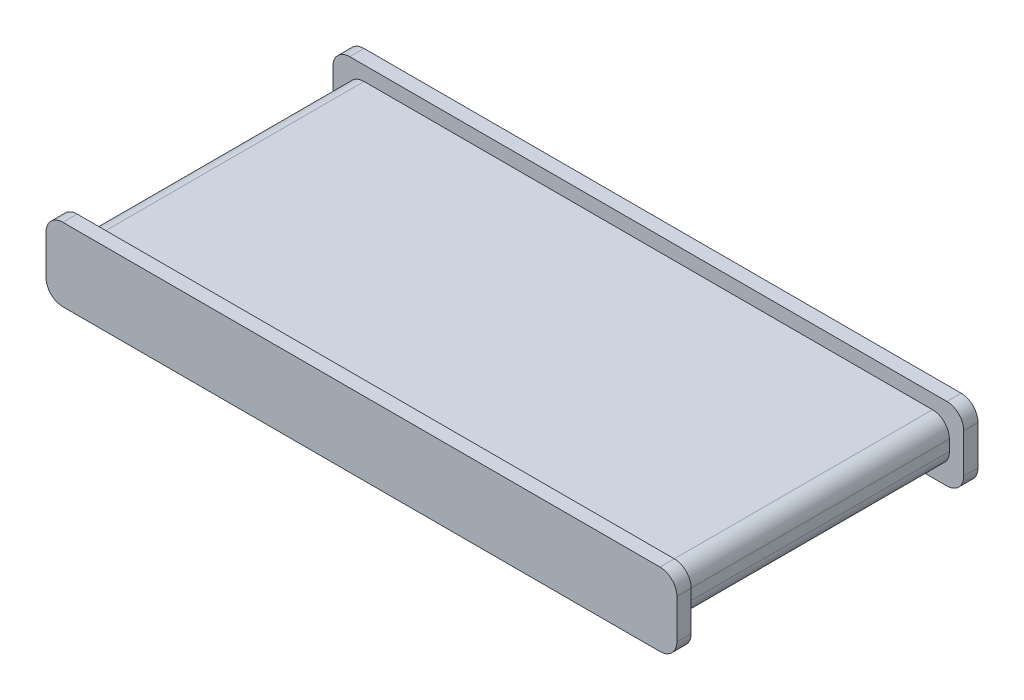
ISO-10303-21;
HEADER;
FILE_DESCRIPTION(('STEP AP214'),'2;1');
FILE_NAME('part.step','',(''),(''),'','','');
FILE_SCHEMA(('AUTOMOTIVE_DESIGN { 1 0 10303 214 1 1 1 1 }'));
ENDSEC;
DATA;
#1=APPLICATION_CONTEXT('core data for automotive mechanical design processes');
#2=APPLICATION_PROTOCOL_DEFINITION('international standard','automotive_design',2000,#1);
#3=PRODUCT_CONTEXT('',#1,'mechanical');
#4=PRODUCT('Part','Part','',(#3));
#5=PRODUCT_RELATED_PRODUCT_CATEGORY('part','',(#4));
#6=PRODUCT_DEFINITION_FORMATION('','',#4);
#7=PRODUCT_DEFINITION_CONTEXT('part definition',#1,'design');
#8=PRODUCT_DEFINITION('design','',#6,#7);
#9=PRODUCT_DEFINITION_SHAPE('','',#8);
#10=(LENGTH_UNIT() NAMED_UNIT(*) SI_UNIT(.MILLI.,.METRE.));
#11=(NAMED_UNIT(*) PLANE_ANGLE_UNIT() SI_UNIT($,.RADIAN.));
#12=(NAMED_UNIT(*) SI_UNIT($,.STERADIAN.) SOLID_ANGLE_UNIT());
#13=UNCERTAINTY_MEASURE_WITH_UNIT(LENGTH_MEASURE(1.E-05),#10,'distance_accuracy_value','');
#14=(GEOMETRIC_REPRESENTATION_CONTEXT(3) GLOBAL_UNCERTAINTY_ASSIGNED_CONTEXT((#13)) GLOBAL_UNIT_ASSIGNED_CONTEXT((#10,
#11,#12)) REPRESENTATION_CONTEXT('',''));
#15=CARTESIAN_POINT('',(0.,0.,0.));
#16=DIRECTION('',(0.,0.,1.));
#17=DIRECTION('',(1.,0.,0.));
#18=AXIS2_PLACEMENT_3D('',#15,#16,#17);
#19=CARTESIAN_POINT('',(107.,0.,48.42));
#20=DIRECTION('',(0.,1.,0.));
#21=DIRECTION('',(-1.,0.,0.));
#22=AXIS2_PLACEMENT_3D('',#19,#20,#21);
#23=PLANE('',#22);
#24=DIRECTION('',(1.,0.,0.));
#25=VECTOR('',#24,1.);
#26=CARTESIAN_POINT('',(107.,0.,0.));
#27=LINE('',#26,#25);
#28=CARTESIAN_POINT('',(3.,0.,0.));
#29=VERTEX_POINT('',#28);
#30=CARTESIAN_POINT('',(104.,0.,0.));
#31=VERTEX_POINT('',#30);
#32=EDGE_CURVE('E377',#29,#31,#27,.T.);
#33=ORIENTED_EDGE('',*,*,#32,.T.);
#34=DIRECTION('',(0.,0.,-1.));
#35=VECTOR('',#34,1.);
#36=CARTESIAN_POINT('',(104.,0.,48.42));
#37=LINE('',#36,#35);
#38=CARTESIAN_POINT('',(104.,0.,48.42));
#39=VERTEX_POINT('',#38);
#40=EDGE_CURVE('E262',#31,#39,#37,.F.);
#41=ORIENTED_EDGE('',*,*,#40,.T.);
#42=DIRECTION('',(1.,0.,0.));
#43=VECTOR('',#42,1.);
#44=CARTESIAN_POINT('',(107.,0.,48.42));
#45=LINE('',#44,#43);
#46=CARTESIAN_POINT('',(3.,0.,48.42));
#47=VERTEX_POINT('',#46);
#48=EDGE_CURVE('E367',#47,#39,#45,.T.);
#49=ORIENTED_EDGE('',*,*,#48,.F.);
#50=DIRECTION('',(0.,0.,-1.));
#51=VECTOR('',#50,1.);
#52=CARTESIAN_POINT('',(3.,0.,48.42));
#53=LINE('',#52,#51);
#54=EDGE_CURVE('E259',#47,#29,#53,.T.);
#55=ORIENTED_EDGE('',*,*,#54,.T.);
#56=EDGE_LOOP('',(#33,#41,#49,#55));
#57=FACE_BOUND('',#56,.T.);
#58=ADVANCED_FACE('F45',(#57),#23,.F.);
#59=CARTESIAN_POINT('',(107.,7.92406687544473,48.42));
#60=DIRECTION('',(-1.,0.,0.));
#61=DIRECTION('',(0.,0.,1.));
#62=AXIS2_PLACEMENT_3D('',#59,#60,#61);
#63=PLANE('',#62);
#64=DIRECTION('',(0.,1.,0.));
#65=VECTOR('',#64,1.);
#66=CARTESIAN_POINT('',(107.,7.92406687544473,0.));
#67=LINE('',#66,#65);
#68=CARTESIAN_POINT('',(107.,3.00000000000001,0.));
#69=VERTEX_POINT('',#68);
#70=CARTESIAN_POINT('',(107.,4.92406687544473,0.));
#71=VERTEX_POINT('',#70);
#72=EDGE_CURVE('E229',#69,#71,#67,.T.);
#73=ORIENTED_EDGE('',*,*,#72,.T.);
#74=DIRECTION('',(0.,0.,-1.));
#75=VECTOR('',#74,1.);
#76=CARTESIAN_POINT('',(107.,4.92406687544473,48.42));
#77=LINE('',#76,#75);
#78=CARTESIAN_POINT('',(107.,4.92406687544473,48.42));
#79=VERTEX_POINT('',#78);
#80=EDGE_CURVE('E247',#71,#79,#77,.F.);
#81=ORIENTED_EDGE('',*,*,#80,.T.);
#82=DIRECTION('',(0.,1.,0.));
#83=VECTOR('',#82,1.);
#84=CARTESIAN_POINT('',(107.,7.92406687544473,48.42));
#85=LINE('',#84,#83);
#86=CARTESIAN_POINT('',(107.,3.00000000000001,48.42));
#87=VERTEX_POINT('',#86);
#88=EDGE_CURVE('E370',#87,#79,#85,.T.);
#89=ORIENTED_EDGE('',*,*,#88,.F.);
#90=DIRECTION('',(0.,0.,-1.));
#91=VECTOR('',#90,1.);
#92=CARTESIAN_POINT('',(107.,3.00000000000001,48.42));
#93=LINE('',#92,#91);
#94=EDGE_CURVE('E244',#87,#69,#93,.T.);
#95=ORIENTED_EDGE('',*,*,#94,.T.);
#96=EDGE_LOOP('',(#73,#81,#89,#95));
#97=FACE_BOUND('',#96,.T.);
#98=ADVANCED_FACE('F402',(#97),#63,.F.);
#99=CARTESIAN_POINT('',(107.,7.92406687544473,48.42));
#100=DIRECTION('',(0.,-1.,0.));
#101=DIRECTION('',(1.,0.,0.));
#102=AXIS2_PLACEMENT_3D('',#99,#100,#101);
#103=PLANE('',#102);
#104=DIRECTION('',(-1.,0.,0.));
#105=VECTOR('',#104,1.);
#106=CARTESIAN_POINT('',(107.,7.92406687544473,48.42));
#107=LINE('',#106,#105);
#108=CARTESIAN_POINT('',(104.,7.92406687544473,48.42));
#109=VERTEX_POINT('',#108);
#110=CARTESIAN_POINT('',(3.,7.92406687544471,48.42));
#111=VERTEX_POINT('',#110);
#112=EDGE_CURVE('E373',#109,#111,#107,.T.);
#113=ORIENTED_EDGE('',*,*,#112,.F.);
#114=DIRECTION('',(0.,0.,-1.));
#115=VECTOR('',#114,1.);
#116=CARTESIAN_POINT('',(104.,7.92406687544473,48.42));
#117=LINE('',#116,#115);
#118=CARTESIAN_POINT('',(104.,7.92406687544473,0.));
#119=VERTEX_POINT('',#118);
#120=EDGE_CURVE('E218',#109,#119,#117,.T.);
#121=ORIENTED_EDGE('',*,*,#120,.T.);
#122=DIRECTION('',(-1.,0.,0.));
#123=VECTOR('',#122,1.);
#124=CARTESIAN_POINT('',(107.,7.92406687544473,0.));
#125=LINE('',#124,#123);
#126=CARTESIAN_POINT('',(3.,7.92406687544471,0.));
#127=VERTEX_POINT('',#126);
#128=EDGE_CURVE('E223',#119,#127,#125,.T.);
#129=ORIENTED_EDGE('',*,*,#128,.T.);
#130=DIRECTION('',(0.,0.,-1.));
#131=VECTOR('',#130,1.);
#132=CARTESIAN_POINT('',(3.,7.92406687544471,48.42));
#133=LINE('',#132,#131);
#134=EDGE_CURVE('E207',#127,#111,#133,.F.);
#135=ORIENTED_EDGE('',*,*,#134,.T.);
#136=EDGE_LOOP('',(#113,#121,#129,#135));
#137=FACE_BOUND('',#136,.T.);
#138=ADVANCED_FACE('F224',(#137),#103,.F.);
#139=CARTESIAN_POINT('',(0.,7.92406687544471,48.42));
#140=DIRECTION('',(1.,0.,0.));
#141=DIRECTION('',(0.,0.,-1.));
#142=AXIS2_PLACEMENT_3D('',#139,#140,#141);
#143=PLANE('',#142);
#144=DIRECTION('',(0.,-1.,0.));
#145=VECTOR('',#144,1.);
#146=CARTESIAN_POINT('',(0.,7.92406687544471,48.42));
#147=LINE('',#146,#145);
#148=CARTESIAN_POINT('',(0.,4.92406687544471,48.42));
#149=VERTEX_POINT('',#148);
#150=CARTESIAN_POINT('',(0.,3.,48.42));
#151=VERTEX_POINT('',#150);
#152=EDGE_CURVE('E219',#149,#151,#147,.T.);
#153=ORIENTED_EDGE('',*,*,#152,.F.);
#154=DIRECTION('',(0.,0.,-1.));
#155=VECTOR('',#154,1.);
#156=CARTESIAN_POINT('',(0.,4.92406687544471,48.42));
#157=LINE('',#156,#155);
#158=CARTESIAN_POINT('',(0.,4.92406687544471,0.));
#159=VERTEX_POINT('',#158);
#160=EDGE_CURVE('E266',#149,#159,#157,.T.);
#161=ORIENTED_EDGE('',*,*,#160,.T.);
#162=DIRECTION('',(0.,-1.,0.));
#163=VECTOR('',#162,1.);
#164=CARTESIAN_POINT('',(0.,7.92406687544471,0.));
#165=LINE('',#164,#163);
#166=CARTESIAN_POINT('',(0.,3.,0.));
#167=VERTEX_POINT('',#166);
#168=EDGE_CURVE('E228',#159,#167,#165,.T.);
#169=ORIENTED_EDGE('',*,*,#168,.T.);
#170=DIRECTION('',(0.,0.,-1.));
#171=VECTOR('',#170,1.);
#172=CARTESIAN_POINT('',(0.,3.,48.42));
#173=LINE('',#172,#171);
#174=EDGE_CURVE('E264',#167,#151,#173,.F.);
#175=ORIENTED_EDGE('',*,*,#174,.T.);
#176=EDGE_LOOP('',(#153,#161,#169,#175));
#177=FACE_BOUND('',#176,.T.);
#178=ADVANCED_FACE('F383',(#177),#143,.F.);
#179=CARTESIAN_POINT('',(104.,4.92406687544473,48.42));
#180=DIRECTION('',(0.,0.,-1.));
#181=DIRECTION('',(-1.,0.,0.));
#182=AXIS2_PLACEMENT_3D('',#179,#180,#181);
#183=CYLINDRICAL_SURFACE('',#182,3.);
#184=CARTESIAN_POINT('',(104.,4.92406687544473,48.42));
#185=DIRECTION('',(0.,0.,1.));
#186=DIRECTION('',(1.,0.,0.));
#187=AXIS2_PLACEMENT_3D('',#184,#185,#186);
#188=CIRCLE('',#187,3.);
#189=EDGE_CURVE('E256',#79,#109,#188,.T.);
#190=ORIENTED_EDGE('',*,*,#189,.F.);
#191=ORIENTED_EDGE('',*,*,#80,.F.);
#192=CARTESIAN_POINT('',(104.,4.92406687544473,0.));
#193=DIRECTION('',(0.,0.,1.));
#194=DIRECTION('',(1.,0.,0.));
#195=AXIS2_PLACEMENT_3D('',#192,#193,#194);
#196=CIRCLE('',#195,3.);
#197=EDGE_CURVE('E238',#119,#71,#196,.F.);
#198=ORIENTED_EDGE('',*,*,#197,.F.);
#199=ORIENTED_EDGE('',*,*,#120,.F.);
#200=EDGE_LOOP('',(#190,#191,#198,#199));
#201=FACE_BOUND('',#200,.T.);
#202=ADVANCED_FACE('F399',(#201),#183,.T.);
#203=CARTESIAN_POINT('',(104.,3.00000000000001,48.42));
#204=DIRECTION('',(0.,0.,-1.));
#205=DIRECTION('',(-1.,0.,0.));
#206=AXIS2_PLACEMENT_3D('',#203,#204,#205);
#207=CYLINDRICAL_SURFACE('',#206,3.);
#208=CARTESIAN_POINT('',(104.,3.00000000000001,48.42));
#209=DIRECTION('',(0.,0.,1.));
#210=DIRECTION('',(1.,0.,0.));
#211=AXIS2_PLACEMENT_3D('',#208,#209,#210);
#212=CIRCLE('',#211,3.);
#213=EDGE_CURVE('E253',#39,#87,#212,.T.);
#214=ORIENTED_EDGE('',*,*,#213,.F.);
#215=ORIENTED_EDGE('',*,*,#40,.F.);
#216=CARTESIAN_POINT('',(104.,3.00000000000001,0.));
#217=DIRECTION('',(0.,0.,1.));
#218=DIRECTION('',(1.,0.,0.));
#219=AXIS2_PLACEMENT_3D('',#216,#217,#218);
#220=CIRCLE('',#219,3.);
#221=EDGE_CURVE('E234',#69,#31,#220,.F.);
#222=ORIENTED_EDGE('',*,*,#221,.F.);
#223=ORIENTED_EDGE('',*,*,#94,.F.);
#224=EDGE_LOOP('',(#214,#215,#222,#223));
#225=FACE_BOUND('',#224,.T.);
#226=ADVANCED_FACE('F394',(#225),#207,.T.);
#227=CARTESIAN_POINT('',(3.,4.92406687544471,48.42));
#228=DIRECTION('',(0.,0.,-1.));
#229=DIRECTION('',(-1.,0.,0.));
#230=AXIS2_PLACEMENT_3D('',#227,#228,#229);
#231=CYLINDRICAL_SURFACE('',#230,3.);
#232=CARTESIAN_POINT('',(3.,4.92406687544471,48.42));
#233=DIRECTION('',(0.,0.,1.));
#234=DIRECTION('',(1.,0.,0.));
#235=AXIS2_PLACEMENT_3D('',#232,#233,#234);
#236=CIRCLE('',#235,3.);
#237=EDGE_CURVE('E215',#111,#149,#236,.T.);
#238=ORIENTED_EDGE('',*,*,#237,.F.);
#239=ORIENTED_EDGE('',*,*,#134,.F.);
#240=CARTESIAN_POINT('',(3.,4.92406687544471,0.));
#241=DIRECTION('',(0.,0.,1.));
#242=DIRECTION('',(1.,0.,0.));
#243=AXIS2_PLACEMENT_3D('',#240,#241,#242);
#244=CIRCLE('',#243,3.);
#245=EDGE_CURVE('E212',#159,#127,#244,.F.);
#246=ORIENTED_EDGE('',*,*,#245,.F.);
#247=ORIENTED_EDGE('',*,*,#160,.F.);
#248=EDGE_LOOP('',(#238,#239,#246,#247));
#249=FACE_BOUND('',#248,.T.);
#250=ADVANCED_FACE('F209',(#249),#231,.T.);
#251=CARTESIAN_POINT('',(3.,3.,48.42));
#252=DIRECTION('',(0.,0.,-1.));
#253=DIRECTION('',(-1.,0.,0.));
#254=AXIS2_PLACEMENT_3D('',#251,#252,#253);
#255=CYLINDRICAL_SURFACE('',#254,3.);
#256=CARTESIAN_POINT('',(3.,3.,48.42));
#257=DIRECTION('',(0.,0.,1.));
#258=DIRECTION('',(1.,0.,0.));
#259=AXIS2_PLACEMENT_3D('',#256,#257,#258);
#260=CIRCLE('',#259,3.);
#261=EDGE_CURVE('E249',#151,#47,#260,.T.);
#262=ORIENTED_EDGE('',*,*,#261,.F.);
#263=ORIENTED_EDGE('',*,*,#174,.F.);
#264=CARTESIAN_POINT('',(3.,3.,0.));
#265=DIRECTION('',(0.,0.,1.));
#266=DIRECTION('',(1.,0.,0.));
#267=AXIS2_PLACEMENT_3D('',#264,#265,#266);
#268=CIRCLE('',#267,3.);
#269=EDGE_CURVE('E235',#29,#167,#268,.F.);
#270=ORIENTED_EDGE('',*,*,#269,.F.);
#271=ORIENTED_EDGE('',*,*,#54,.F.);
#272=EDGE_LOOP('',(#262,#263,#270,#271));
#273=FACE_BOUND('',#272,.T.);
#274=ADVANCED_FACE('F386',(#273),#255,.T.);
#275=CARTESIAN_POINT('',(-2.54,-2.54,50.96));
#276=DIRECTION('',(1.,0.,0.));
#277=DIRECTION('',(0.,0.,-1.));
#278=AXIS2_PLACEMENT_3D('',#275,#276,#277);
#279=PLANE('',#278);
#280=DIRECTION('',(0.,-1.,0.));
#281=VECTOR('',#280,1.);
#282=CARTESIAN_POINT('',(-2.54,-2.54,50.96));
#283=LINE('',#282,#281);
#284=CARTESIAN_POINT('',(-2.54,7.46406687544473,50.96));
#285=VERTEX_POINT('',#284);
#286=CARTESIAN_POINT('',(-2.54,0.46,50.96));
#287=VERTEX_POINT('',#286);
#288=EDGE_CURVE('E337',#285,#287,#283,.T.);
#289=ORIENTED_EDGE('',*,*,#288,.F.);
#290=DIRECTION('',(0.,0.,-1.));
#291=VECTOR('',#290,1.);
#292=CARTESIAN_POINT('',(-2.54,7.46406687544473,50.96));
#293=LINE('',#292,#291);
#294=CARTESIAN_POINT('',(-2.54,7.46406687544473,48.42));
#295=VERTEX_POINT('',#294);
#296=EDGE_CURVE('E11',#285,#295,#293,.T.);
#297=ORIENTED_EDGE('',*,*,#296,.T.);
#298=DIRECTION('',(0.,-1.,0.));
#299=VECTOR('',#298,1.);
#300=CARTESIAN_POINT('',(-2.54,-2.54,48.42));
#301=LINE('',#300,#299);
#302=CARTESIAN_POINT('',(-2.54,0.46,48.42));
#303=VERTEX_POINT('',#302);
#304=EDGE_CURVE('E340',#295,#303,#301,.T.);
#305=ORIENTED_EDGE('',*,*,#304,.T.);
#306=DIRECTION('',(0.,0.,-1.));
#307=VECTOR('',#306,1.);
#308=CARTESIAN_POINT('',(-2.54,0.46,50.96));
#309=LINE('',#308,#307);
#310=EDGE_CURVE('E53',#303,#287,#309,.F.);
#311=ORIENTED_EDGE('',*,*,#310,.T.);
#312=EDGE_LOOP('',(#289,#297,#305,#311));
#313=FACE_BOUND('',#312,.T.);
#314=ADVANCED_FACE('F336',(#313),#279,.F.);
#315=CARTESIAN_POINT('',(-2.54,-2.54,50.96));
#316=DIRECTION('',(0.,1.,0.));
#317=DIRECTION('',(0.,0.,1.));
#318=AXIS2_PLACEMENT_3D('',#315,#316,#317);
#319=PLANE('',#318);
#320=DIRECTION('',(1.,0.,0.));
#321=VECTOR('',#320,1.);
#322=CARTESIAN_POINT('',(-2.54,-2.54,48.42));
#323=LINE('',#322,#321);
#324=CARTESIAN_POINT('',(0.459999999999999,-2.54,48.42));
#325=VERTEX_POINT('',#324);
#326=CARTESIAN_POINT('',(106.54,-2.54,48.42));
#327=VERTEX_POINT('',#326);
#328=EDGE_CURVE('E352',#325,#327,#323,.T.);
#329=ORIENTED_EDGE('',*,*,#328,.T.);
#330=DIRECTION('',(0.,0.,-1.));
#331=VECTOR('',#330,1.);
#332=CARTESIAN_POINT('',(106.54,-2.54,50.96));
#333=LINE('',#332,#331);
#334=CARTESIAN_POINT('',(106.54,-2.54,50.96));
#335=VERTEX_POINT('',#334);
#336=EDGE_CURVE('E60',#327,#335,#333,.F.);
#337=ORIENTED_EDGE('',*,*,#336,.T.);
#338=DIRECTION('',(1.,0.,0.));
#339=VECTOR('',#338,1.);
#340=CARTESIAN_POINT('',(-2.54,-2.54,50.96));
#341=LINE('',#340,#339);
#342=CARTESIAN_POINT('',(0.459999999999999,-2.54,50.96));
#343=VERTEX_POINT('',#342);
#344=EDGE_CURVE('E346',#343,#335,#341,.T.);
#345=ORIENTED_EDGE('',*,*,#344,.F.);
#346=DIRECTION('',(0.,0.,-1.));
#347=VECTOR('',#346,1.);
#348=CARTESIAN_POINT('',(0.46,-2.54,50.96));
#349=LINE('',#348,#347);
#350=EDGE_CURVE('E329',#343,#325,#349,.T.);
#351=ORIENTED_EDGE('',*,*,#350,.T.);
#352=EDGE_LOOP('',(#329,#337,#345,#351));
#353=FACE_BOUND('',#352,.T.);
#354=ADVANCED_FACE('F351',(#353),#319,.F.);
#355=CARTESIAN_POINT('',(109.54,-2.54,50.96));
#356=DIRECTION('',(-1.,0.,0.));
#357=DIRECTION('',(0.,0.,1.));
#358=AXIS2_PLACEMENT_3D('',#355,#356,#357);
#359=PLANE('',#358);
#360=DIRECTION('',(0.,1.,0.));
#361=VECTOR('',#360,1.);
#362=CARTESIAN_POINT('',(109.54,-2.54,48.42));
#363=LINE('',#362,#361);
#364=CARTESIAN_POINT('',(109.54,0.46,48.42));
#365=VERTEX_POINT('',#364);
#366=CARTESIAN_POINT('',(109.54,7.46406687544473,48.42));
#367=VERTEX_POINT('',#366);
#368=EDGE_CURVE('E357',#365,#367,#363,.T.);
#369=ORIENTED_EDGE('',*,*,#368,.T.);
#370=DIRECTION('',(0.,0.,-1.));
#371=VECTOR('',#370,1.);
#372=CARTESIAN_POINT('',(109.54,7.46406687544473,50.96));
#373=LINE('',#372,#371);
#374=CARTESIAN_POINT('',(109.54,7.46406687544473,50.96));
#375=VERTEX_POINT('',#374);
#376=EDGE_CURVE('E320',#367,#375,#373,.F.);
#377=ORIENTED_EDGE('',*,*,#376,.T.);
#378=DIRECTION('',(0.,1.,0.));
#379=VECTOR('',#378,1.);
#380=CARTESIAN_POINT('',(109.54,-2.54,50.96));
#381=LINE('',#380,#379);
#382=CARTESIAN_POINT('',(109.54,0.46,50.96));
#383=VERTEX_POINT('',#382);
#384=EDGE_CURVE('E462',#383,#375,#381,.T.);
#385=ORIENTED_EDGE('',*,*,#384,.F.);
#386=DIRECTION('',(0.,0.,-1.));
#387=VECTOR('',#386,1.);
#388=CARTESIAN_POINT('',(109.54,0.46,50.96));
#389=LINE('',#388,#387);
#390=EDGE_CURVE('E317',#383,#365,#389,.T.);
#391=ORIENTED_EDGE('',*,*,#390,.T.);
#392=EDGE_LOOP('',(#369,#377,#385,#391));
#393=FACE_BOUND('',#392,.T.);
#394=ADVANCED_FACE('F459',(#393),#359,.F.);
#395=CARTESIAN_POINT('',(-2.54,10.4640668754447,50.96));
#396=DIRECTION('',(0.,-1.,0.));
#397=DIRECTION('',(0.,0.,-1.));
#398=AXIS2_PLACEMENT_3D('',#395,#396,#397);
#399=PLANE('',#398);
#400=DIRECTION('',(-1.,0.,0.));
#401=VECTOR('',#400,1.);
#402=CARTESIAN_POINT('',(-2.54,10.4640668754447,50.96));
#403=LINE('',#402,#401);
#404=CARTESIAN_POINT('',(106.54,10.4640668754447,50.96));
#405=VERTEX_POINT('',#404);
#406=CARTESIAN_POINT('',(0.459999999999999,10.4640668754447,50.96));
#407=VERTEX_POINT('',#406);
#408=EDGE_CURVE('E379',#405,#407,#403,.T.);
#409=ORIENTED_EDGE('',*,*,#408,.F.);
#410=DIRECTION('',(0.,0.,-1.));
#411=VECTOR('',#410,1.);
#412=CARTESIAN_POINT('',(106.54,10.4640668754447,50.96));
#413=LINE('',#412,#411);
#414=CARTESIAN_POINT('',(106.54,10.4640668754447,48.42));
#415=VERTEX_POINT('',#414);
#416=EDGE_CURVE('E306',#405,#415,#413,.T.);
#417=ORIENTED_EDGE('',*,*,#416,.T.);
#418=DIRECTION('',(-1.,0.,0.));
#419=VECTOR('',#418,1.);
#420=CARTESIAN_POINT('',(-2.54,10.4640668754447,48.42));
#421=LINE('',#420,#419);
#422=CARTESIAN_POINT('',(0.459999999999999,10.4640668754447,48.42));
#423=VERTEX_POINT('',#422);
#424=EDGE_CURVE('E347',#415,#423,#421,.T.);
#425=ORIENTED_EDGE('',*,*,#424,.T.);
#426=DIRECTION('',(0.,0.,-1.));
#427=VECTOR('',#426,1.);
#428=CARTESIAN_POINT('',(0.46,10.4640668754447,50.96));
#429=LINE('',#428,#427);
#430=EDGE_CURVE('E304',#423,#407,#429,.F.);
#431=ORIENTED_EDGE('',*,*,#430,.T.);
#432=EDGE_LOOP('',(#409,#417,#425,#431));
#433=FACE_BOUND('',#432,.T.);
#434=ADVANCED_FACE('F454',(#433),#399,.F.);
#435=CARTESIAN_POINT('',(0.,0.,50.96));
#436=DIRECTION('',(0.,0.,-1.));
#437=DIRECTION('',(-1.,0.,0.));
#438=AXIS2_PLACEMENT_3D('',#435,#436,#437);
#439=PLANE('',#438);
#440=ORIENTED_EDGE('',*,*,#384,.T.);
#441=CARTESIAN_POINT('',(106.54,7.46406687544473,50.96));
#442=DIRECTION('',(0.,0.,-1.));
#443=DIRECTION('',(-1.,0.,0.));
#444=AXIS2_PLACEMENT_3D('',#441,#442,#443);
#445=CIRCLE('',#444,3.);
#446=EDGE_CURVE('E327',#375,#405,#445,.F.);
#447=ORIENTED_EDGE('',*,*,#446,.T.);
#448=ORIENTED_EDGE('',*,*,#408,.T.);
#449=CARTESIAN_POINT('',(0.46,7.46406687544473,50.96));
#450=DIRECTION('',(0.,0.,-1.));
#451=DIRECTION('',(-1.,0.,0.));
#452=AXIS2_PLACEMENT_3D('',#449,#450,#451);
#453=CIRCLE('',#452,3.);
#454=EDGE_CURVE('E323',#407,#285,#453,.F.);
#455=ORIENTED_EDGE('',*,*,#454,.T.);
#456=ORIENTED_EDGE('',*,*,#288,.T.);
#457=CARTESIAN_POINT('',(0.46,0.46,50.96));
#458=DIRECTION('',(0.,0.,-1.));
#459=DIRECTION('',(-1.,0.,0.));
#460=AXIS2_PLACEMENT_3D('',#457,#458,#459);
#461=CIRCLE('',#460,3.);
#462=EDGE_CURVE('E67',#287,#343,#461,.F.);
#463=ORIENTED_EDGE('',*,*,#462,.T.);
#464=ORIENTED_EDGE('',*,*,#344,.T.);
#465=CARTESIAN_POINT('',(106.54,0.46,50.96));
#466=DIRECTION('',(0.,0.,-1.));
#467=DIRECTION('',(-1.,0.,0.));
#468=AXIS2_PLACEMENT_3D('',#465,#466,#467);
#469=CIRCLE('',#468,3.);
#470=EDGE_CURVE('E325',#335,#383,#469,.F.);
#471=ORIENTED_EDGE('',*,*,#470,.T.);
#472=EDGE_LOOP('',(#440,#447,#448,#455,#456,#463,#464,#471));
#473=FACE_BOUND('',#472,.T.);
#474=ADVANCED_FACE('F343',(#473),#439,.F.);
#475=CARTESIAN_POINT('',(0.,0.,48.42));
#476=DIRECTION('',(0.,0.,-1.));
#477=DIRECTION('',(-1.,0.,0.));
#478=AXIS2_PLACEMENT_3D('',#475,#476,#477);
#479=PLANE('',#478);
#480=ORIENTED_EDGE('',*,*,#213,.T.);
#481=ORIENTED_EDGE('',*,*,#88,.T.);
#482=ORIENTED_EDGE('',*,*,#189,.T.);
#483=ORIENTED_EDGE('',*,*,#112,.T.);
#484=ORIENTED_EDGE('',*,*,#237,.T.);
#485=ORIENTED_EDGE('',*,*,#152,.T.);
#486=ORIENTED_EDGE('',*,*,#261,.T.);
#487=ORIENTED_EDGE('',*,*,#48,.T.);
#488=EDGE_LOOP('',(#480,#481,#482,#483,#484,#485,#486,#487));
#489=FACE_BOUND('',#488,.T.);
#490=ORIENTED_EDGE('',*,*,#424,.F.);
#491=CARTESIAN_POINT('',(106.54,7.46406687544473,48.42));
#492=DIRECTION('',(0.,0.,-1.));
#493=DIRECTION('',(-1.,0.,0.));
#494=AXIS2_PLACEMENT_3D('',#491,#492,#493);
#495=CIRCLE('',#494,3.);
#496=EDGE_CURVE('E315',#415,#367,#495,.T.);
#497=ORIENTED_EDGE('',*,*,#496,.T.);
#498=ORIENTED_EDGE('',*,*,#368,.F.);
#499=CARTESIAN_POINT('',(106.54,0.46,48.42));
#500=DIRECTION('',(0.,0.,-1.));
#501=DIRECTION('',(-1.,0.,0.));
#502=AXIS2_PLACEMENT_3D('',#499,#500,#501);
#503=CIRCLE('',#502,3.);
#504=EDGE_CURVE('E313',#365,#327,#503,.T.);
#505=ORIENTED_EDGE('',*,*,#504,.T.);
#506=ORIENTED_EDGE('',*,*,#328,.F.);
#507=CARTESIAN_POINT('',(0.46,0.46,48.42));
#508=DIRECTION('',(0.,0.,-1.));
#509=DIRECTION('',(-1.,0.,0.));
#510=AXIS2_PLACEMENT_3D('',#507,#508,#509);
#511=CIRCLE('',#510,3.);
#512=EDGE_CURVE('E309',#325,#303,#511,.T.);
#513=ORIENTED_EDGE('',*,*,#512,.T.);
#514=ORIENTED_EDGE('',*,*,#304,.F.);
#515=CARTESIAN_POINT('',(0.46,7.46406687544473,48.42));
#516=DIRECTION('',(0.,0.,-1.));
#517=DIRECTION('',(-1.,0.,0.));
#518=AXIS2_PLACEMENT_3D('',#515,#516,#517);
#519=CIRCLE('',#518,3.);
#520=EDGE_CURVE('E311',#295,#423,#519,.T.);
#521=ORIENTED_EDGE('',*,*,#520,.T.);
#522=EDGE_LOOP('',(#490,#497,#498,#505,#506,#513,#514,#521));
#523=FACE_BOUND('',#522,.T.);
#524=ADVANCED_FACE('F355',(#489,#523),#479,.T.);
#525=CARTESIAN_POINT('',(0.,0.,0.));
#526=DIRECTION('',(0.,0.,-1.));
#527=DIRECTION('',(-1.,0.,0.));
#528=AXIS2_PLACEMENT_3D('',#525,#526,#527);
#529=PLANE('',#528);
#530=DIRECTION('',(0.,1.,0.));
#531=VECTOR('',#530,1.);
#532=CARTESIAN_POINT('',(-2.54,10.4640668754447,0.));
#533=LINE('',#532,#531);
#534=CARTESIAN_POINT('',(-2.54,0.46,0.));
#535=VERTEX_POINT('',#534);
#536=CARTESIAN_POINT('',(-2.54,7.46406687544473,0.));
#537=VERTEX_POINT('',#536);
#538=EDGE_CURVE('E471',#535,#537,#533,.T.);
#539=ORIENTED_EDGE('',*,*,#538,.F.);
#540=CARTESIAN_POINT('',(0.46,0.46,0.));
#541=DIRECTION('',(0.,0.,-1.));
#542=DIRECTION('',(-1.,0.,0.));
#543=AXIS2_PLACEMENT_3D('',#540,#541,#542);
#544=CIRCLE('',#543,3.);
#545=CARTESIAN_POINT('',(0.46000000000003,-2.54,0.));
#546=VERTEX_POINT('',#545);
#547=EDGE_CURVE('E279',#535,#546,#544,.F.);
#548=ORIENTED_EDGE('',*,*,#547,.T.);
#549=DIRECTION('',(-1.,0.,0.));
#550=VECTOR('',#549,1.);
#551=CARTESIAN_POINT('',(109.54,-2.54,0.));
#552=LINE('',#551,#550);
#553=CARTESIAN_POINT('',(106.54,-2.54,0.));
#554=VERTEX_POINT('',#553);
#555=EDGE_CURVE('E474',#554,#546,#552,.T.);
#556=ORIENTED_EDGE('',*,*,#555,.F.);
#557=CARTESIAN_POINT('',(106.54,0.46,0.));
#558=DIRECTION('',(0.,0.,-1.));
#559=DIRECTION('',(-1.,0.,0.));
#560=AXIS2_PLACEMENT_3D('',#557,#558,#559);
#561=CIRCLE('',#560,3.);
#562=CARTESIAN_POINT('',(109.54,0.46,0.));
#563=VERTEX_POINT('',#562);
#564=EDGE_CURVE('E273',#554,#563,#561,.F.);
#565=ORIENTED_EDGE('',*,*,#564,.T.);
#566=DIRECTION('',(0.,-1.,0.));
#567=VECTOR('',#566,1.);
#568=CARTESIAN_POINT('',(109.54,10.4640668754447,0.));
#569=LINE('',#568,#567);
#570=CARTESIAN_POINT('',(109.54,7.46406687544473,0.));
#571=VERTEX_POINT('',#570);
#572=EDGE_CURVE('E477',#571,#563,#569,.T.);
#573=ORIENTED_EDGE('',*,*,#572,.F.);
#574=CARTESIAN_POINT('',(106.54,7.46406687544473,0.));
#575=DIRECTION('',(0.,0.,-1.));
#576=DIRECTION('',(-1.,0.,0.));
#577=AXIS2_PLACEMENT_3D('',#574,#575,#576);
#578=CIRCLE('',#577,3.);
#579=CARTESIAN_POINT('',(106.54,10.4640668754447,0.));
#580=VERTEX_POINT('',#579);
#581=EDGE_CURVE('E275',#571,#580,#578,.F.);
#582=ORIENTED_EDGE('',*,*,#581,.T.);
#583=DIRECTION('',(1.,0.,0.));
#584=VECTOR('',#583,1.);
#585=CARTESIAN_POINT('',(109.54,10.4640668754447,0.));
#586=LINE('',#585,#584);
#587=CARTESIAN_POINT('',(0.46000000000003,10.4640668754447,0.));
#588=VERTEX_POINT('',#587);
#589=EDGE_CURVE('E467',#588,#580,#586,.T.);
#590=ORIENTED_EDGE('',*,*,#589,.F.);
#591=CARTESIAN_POINT('',(0.460000000000002,7.46406687544473,0.));
#592=DIRECTION('',(0.,0.,-1.));
#593=DIRECTION('',(-1.,0.,0.));
#594=AXIS2_PLACEMENT_3D('',#591,#592,#593);
#595=CIRCLE('',#594,3.);
#596=EDGE_CURVE('E277',#588,#537,#595,.F.);
#597=ORIENTED_EDGE('',*,*,#596,.T.);
#598=EDGE_LOOP('',(#539,#548,#556,#565,#573,#582,#590,#597));
#599=FACE_BOUND('',#598,.T.);
#600=ORIENTED_EDGE('',*,*,#128,.F.);
#601=ORIENTED_EDGE('',*,*,#197,.T.);
#602=ORIENTED_EDGE('',*,*,#72,.F.);
#603=ORIENTED_EDGE('',*,*,#221,.T.);
#604=ORIENTED_EDGE('',*,*,#32,.F.);
#605=ORIENTED_EDGE('',*,*,#269,.T.);
#606=ORIENTED_EDGE('',*,*,#168,.F.);
#607=ORIENTED_EDGE('',*,*,#245,.T.);
#608=EDGE_LOOP('',(#600,#601,#602,#603,#604,#605,#606,#607));
#609=FACE_BOUND('',#608,.T.);
#610=ADVANCED_FACE('F232',(#599,#609),#529,.F.);
#611=CARTESIAN_POINT('',(109.54,10.4640668754447,-2.54));
#612=DIRECTION('',(-1.,0.,0.));
#613=DIRECTION('',(0.,0.,1.));
#614=AXIS2_PLACEMENT_3D('',#611,#612,#613);
#615=PLANE('',#614);
#616=DIRECTION('',(0.,-1.,0.));
#617=VECTOR('',#616,1.);
#618=CARTESIAN_POINT('',(109.54,10.4640668754447,-2.54));
#619=LINE('',#618,#617);
#620=CARTESIAN_POINT('',(109.54,7.46406687544473,-2.54));
#621=VERTEX_POINT('',#620);
#622=CARTESIAN_POINT('',(109.54,0.46,-2.54));
#623=VERTEX_POINT('',#622);
#624=EDGE_CURVE('E470',#621,#623,#619,.T.);
#625=ORIENTED_EDGE('',*,*,#624,.F.);
#626=DIRECTION('',(0.,0.,1.));
#627=VECTOR('',#626,1.);
#628=CARTESIAN_POINT('',(109.54,7.46406687544473,-2.54));
#629=LINE('',#628,#627);
#630=EDGE_CURVE('E301',#621,#571,#629,.T.);
#631=ORIENTED_EDGE('',*,*,#630,.T.);
#632=ORIENTED_EDGE('',*,*,#572,.T.);
#633=DIRECTION('',(0.,0.,1.));
#634=VECTOR('',#633,1.);
#635=CARTESIAN_POINT('',(109.54,0.46,-2.54));
#636=LINE('',#635,#634);
#637=EDGE_CURVE('E299',#563,#623,#636,.F.);
#638=ORIENTED_EDGE('',*,*,#637,.T.);
#639=EDGE_LOOP('',(#625,#631,#632,#638));
#640=FACE_BOUND('',#639,.T.);
#641=ADVANCED_FACE('F518',(#640),#615,.F.);
#642=CARTESIAN_POINT('',(109.54,-2.54,-2.54));
#643=DIRECTION('',(0.,1.,0.));
#644=DIRECTION('',(0.,0.,1.));
#645=AXIS2_PLACEMENT_3D('',#642,#643,#644);
#646=PLANE('',#645);
#647=ORIENTED_EDGE('',*,*,#555,.T.);
#648=DIRECTION('',(0.,0.,1.));
#649=VECTOR('',#648,1.);
#650=CARTESIAN_POINT('',(0.460000000000002,-2.54,-2.54));
#651=LINE('',#650,#649);
#652=CARTESIAN_POINT('',(0.46000000000003,-2.54,-2.54));
#653=VERTEX_POINT('',#652);
#654=EDGE_CURVE('E284',#546,#653,#651,.F.);
#655=ORIENTED_EDGE('',*,*,#654,.T.);
#656=DIRECTION('',(-1.,0.,0.));
#657=VECTOR('',#656,1.);
#658=CARTESIAN_POINT('',(109.54,-2.54,-2.54));
#659=LINE('',#658,#657);
#660=CARTESIAN_POINT('',(106.54,-2.54,-2.54));
#661=VERTEX_POINT('',#660);
#662=EDGE_CURVE('E485',#661,#653,#659,.T.);
#663=ORIENTED_EDGE('',*,*,#662,.F.);
#664=DIRECTION('',(0.,0.,1.));
#665=VECTOR('',#664,1.);
#666=CARTESIAN_POINT('',(106.54,-2.54,-2.54));
#667=LINE('',#666,#665);
#668=EDGE_CURVE('E281',#661,#554,#667,.T.);
#669=ORIENTED_EDGE('',*,*,#668,.T.);
#670=EDGE_LOOP('',(#647,#655,#663,#669));
#671=FACE_BOUND('',#670,.T.);
#672=ADVANCED_FACE('F500',(#671),#646,.F.);
#673=CARTESIAN_POINT('',(-2.54,10.4640668754447,-2.54));
#674=DIRECTION('',(1.,0.,0.));
#675=DIRECTION('',(0.,0.,-1.));
#676=AXIS2_PLACEMENT_3D('',#673,#674,#675);
#677=PLANE('',#676);
#678=DIRECTION('',(0.,1.,0.));
#679=VECTOR('',#678,1.);
#680=CARTESIAN_POINT('',(-2.54,10.4640668754447,-2.54));
#681=LINE('',#680,#679);
#682=CARTESIAN_POINT('',(-2.54,0.46,-2.54));
#683=VERTEX_POINT('',#682);
#684=CARTESIAN_POINT('',(-2.54,7.46406687544473,-2.54));
#685=VERTEX_POINT('',#684);
#686=EDGE_CURVE('E482',#683,#685,#681,.T.);
#687=ORIENTED_EDGE('',*,*,#686,.F.);
#688=DIRECTION('',(0.,0.,1.));
#689=VECTOR('',#688,1.);
#690=CARTESIAN_POINT('',(-2.54,0.46,-2.54));
#691=LINE('',#690,#689);
#692=EDGE_CURVE('E270',#683,#535,#691,.T.);
#693=ORIENTED_EDGE('',*,*,#692,.T.);
#694=ORIENTED_EDGE('',*,*,#538,.T.);
#695=DIRECTION('',(0.,0.,1.));
#696=VECTOR('',#695,1.);
#697=CARTESIAN_POINT('',(-2.54,7.46406687544473,-2.54));
#698=LINE('',#697,#696);
#699=EDGE_CURVE('E268',#537,#685,#698,.F.);
#700=ORIENTED_EDGE('',*,*,#699,.T.);
#701=EDGE_LOOP('',(#687,#693,#694,#700));
#702=FACE_BOUND('',#701,.T.);
#703=ADVANCED_FACE('F509',(#702),#677,.F.);
#704=CARTESIAN_POINT('',(109.54,10.4640668754447,-2.54));
#705=DIRECTION('',(0.,-1.,0.));
#706=DIRECTION('',(0.,0.,-1.));
#707=AXIS2_PLACEMENT_3D('',#704,#705,#706);
#708=PLANE('',#707);
#709=DIRECTION('',(1.,0.,0.));
#710=VECTOR('',#709,1.);
#711=CARTESIAN_POINT('',(109.54,10.4640668754447,-2.54));
#712=LINE('',#711,#710);
#713=CARTESIAN_POINT('',(0.46000000000003,10.4640668754447,-2.54));
#714=VERTEX_POINT('',#713);
#715=CARTESIAN_POINT('',(106.54,10.4640668754447,-2.54));
#716=VERTEX_POINT('',#715);
#717=EDGE_CURVE('E361',#714,#716,#712,.T.);
#718=ORIENTED_EDGE('',*,*,#717,.F.);
#719=DIRECTION('',(0.,0.,1.));
#720=VECTOR('',#719,1.);
#721=CARTESIAN_POINT('',(0.460000000000002,10.4640668754447,-2.54));
#722=LINE('',#721,#720);
#723=EDGE_CURVE('E296',#714,#588,#722,.T.);
#724=ORIENTED_EDGE('',*,*,#723,.T.);
#725=ORIENTED_EDGE('',*,*,#589,.T.);
#726=DIRECTION('',(0.,0.,1.));
#727=VECTOR('',#726,1.);
#728=CARTESIAN_POINT('',(106.54,10.4640668754447,-2.54));
#729=LINE('',#728,#727);
#730=EDGE_CURVE('E294',#580,#716,#729,.F.);
#731=ORIENTED_EDGE('',*,*,#730,.T.);
#732=EDGE_LOOP('',(#718,#724,#725,#731));
#733=FACE_BOUND('',#732,.T.);
#734=ADVANCED_FACE('F516',(#733),#708,.F.);
#735=CARTESIAN_POINT('',(0.,0.,-2.54));
#736=DIRECTION('',(0.,0.,-1.));
#737=DIRECTION('',(-1.,0.,0.));
#738=AXIS2_PLACEMENT_3D('',#735,#736,#737);
#739=PLANE('',#738);
#740=ORIENTED_EDGE('',*,*,#662,.T.);
#741=CARTESIAN_POINT('',(0.46,0.46,-2.54));
#742=DIRECTION('',(0.,0.,-1.));
#743=DIRECTION('',(-1.,0.,0.));
#744=AXIS2_PLACEMENT_3D('',#741,#742,#743);
#745=CIRCLE('',#744,3.);
#746=EDGE_CURVE('E292',#653,#683,#745,.T.);
#747=ORIENTED_EDGE('',*,*,#746,.T.);
#748=ORIENTED_EDGE('',*,*,#686,.T.);
#749=CARTESIAN_POINT('',(0.460000000000002,7.46406687544473,-2.54));
#750=DIRECTION('',(0.,0.,-1.));
#751=DIRECTION('',(-1.,0.,0.));
#752=AXIS2_PLACEMENT_3D('',#749,#750,#751);
#753=CIRCLE('',#752,3.);
#754=EDGE_CURVE('E290',#685,#714,#753,.T.);
#755=ORIENTED_EDGE('',*,*,#754,.T.);
#756=ORIENTED_EDGE('',*,*,#717,.T.);
#757=CARTESIAN_POINT('',(106.54,7.46406687544473,-2.54));
#758=DIRECTION('',(0.,0.,-1.));
#759=DIRECTION('',(-1.,0.,0.));
#760=AXIS2_PLACEMENT_3D('',#757,#758,#759);
#761=CIRCLE('',#760,3.);
#762=EDGE_CURVE('E288',#716,#621,#761,.T.);
#763=ORIENTED_EDGE('',*,*,#762,.T.);
#764=ORIENTED_EDGE('',*,*,#624,.T.);
#765=CARTESIAN_POINT('',(106.54,0.46,-2.54));
#766=DIRECTION('',(0.,0.,-1.));
#767=DIRECTION('',(-1.,0.,0.));
#768=AXIS2_PLACEMENT_3D('',#765,#766,#767);
#769=CIRCLE('',#768,3.);
#770=EDGE_CURVE('E286',#623,#661,#769,.T.);
#771=ORIENTED_EDGE('',*,*,#770,.T.);
#772=EDGE_LOOP('',(#740,#747,#748,#755,#756,#763,#764,#771));
#773=FACE_BOUND('',#772,.T.);
#774=ADVANCED_FACE('F425',(#773),#739,.T.);
#775=CARTESIAN_POINT('',(0.46,0.46,-2.54));
#776=DIRECTION('',(0.,0.,1.));
#777=DIRECTION('',(1.,0.,0.));
#778=AXIS2_PLACEMENT_3D('',#775,#776,#777);
#779=CYLINDRICAL_SURFACE('',#778,3.);
#780=ORIENTED_EDGE('',*,*,#746,.F.);
#781=ORIENTED_EDGE('',*,*,#654,.F.);
#782=ORIENTED_EDGE('',*,*,#547,.F.);
#783=ORIENTED_EDGE('',*,*,#692,.F.);
#784=EDGE_LOOP('',(#780,#781,#782,#783));
#785=FACE_BOUND('',#784,.T.);
#786=ADVANCED_FACE('F421',(#785),#779,.T.);
#787=CARTESIAN_POINT('',(0.460000000000002,7.46406687544473,-2.54));
#788=DIRECTION('',(0.,0.,1.));
#789=DIRECTION('',(1.,0.,0.));
#790=AXIS2_PLACEMENT_3D('',#787,#788,#789);
#791=CYLINDRICAL_SURFACE('',#790,3.);
#792=ORIENTED_EDGE('',*,*,#754,.F.);
#793=ORIENTED_EDGE('',*,*,#699,.F.);
#794=ORIENTED_EDGE('',*,*,#596,.F.);
#795=ORIENTED_EDGE('',*,*,#723,.F.);
#796=EDGE_LOOP('',(#792,#793,#794,#795));
#797=FACE_BOUND('',#796,.T.);
#798=ADVANCED_FACE('F424',(#797),#791,.T.);
#799=CARTESIAN_POINT('',(106.54,7.46406687544473,-2.54));
#800=DIRECTION('',(0.,0.,1.));
#801=DIRECTION('',(1.,0.,0.));
#802=AXIS2_PLACEMENT_3D('',#799,#800,#801);
#803=CYLINDRICAL_SURFACE('',#802,3.);
#804=ORIENTED_EDGE('',*,*,#762,.F.);
#805=ORIENTED_EDGE('',*,*,#730,.F.);
#806=ORIENTED_EDGE('',*,*,#581,.F.);
#807=ORIENTED_EDGE('',*,*,#630,.F.);
#808=EDGE_LOOP('',(#804,#805,#806,#807));
#809=FACE_BOUND('',#808,.T.);
#810=ADVANCED_FACE('F429',(#809),#803,.T.);
#811=CARTESIAN_POINT('',(106.54,0.46,-2.54));
#812=DIRECTION('',(0.,0.,1.));
#813=DIRECTION('',(1.,0.,0.));
#814=AXIS2_PLACEMENT_3D('',#811,#812,#813);
#815=CYLINDRICAL_SURFACE('',#814,3.);
#816=ORIENTED_EDGE('',*,*,#770,.F.);
#817=ORIENTED_EDGE('',*,*,#637,.F.);
#818=ORIENTED_EDGE('',*,*,#564,.F.);
#819=ORIENTED_EDGE('',*,*,#668,.F.);
#820=EDGE_LOOP('',(#816,#817,#818,#819));
#821=FACE_BOUND('',#820,.T.);
#822=ADVANCED_FACE('F433',(#821),#815,.T.);
#823=CARTESIAN_POINT('',(106.54,7.46406687544473,50.96));
#824=DIRECTION('',(0.,0.,-1.));
#825=DIRECTION('',(-1.,0.,0.));
#826=AXIS2_PLACEMENT_3D('',#823,#824,#825);
#827=CYLINDRICAL_SURFACE('',#826,3.);
#828=ORIENTED_EDGE('',*,*,#446,.F.);
#829=ORIENTED_EDGE('',*,*,#376,.F.);
#830=ORIENTED_EDGE('',*,*,#496,.F.);
#831=ORIENTED_EDGE('',*,*,#416,.F.);
#832=EDGE_LOOP('',(#828,#829,#830,#831));
#833=FACE_BOUND('',#832,.T.);
#834=ADVANCED_FACE('F437',(#833),#827,.T.);
#835=CARTESIAN_POINT('',(106.54,0.46,50.96));
#836=DIRECTION('',(0.,0.,-1.));
#837=DIRECTION('',(-1.,0.,0.));
#838=AXIS2_PLACEMENT_3D('',#835,#836,#837);
#839=CYLINDRICAL_SURFACE('',#838,3.);
#840=ORIENTED_EDGE('',*,*,#470,.F.);
#841=ORIENTED_EDGE('',*,*,#336,.F.);
#842=ORIENTED_EDGE('',*,*,#504,.F.);
#843=ORIENTED_EDGE('',*,*,#390,.F.);
#844=EDGE_LOOP('',(#840,#841,#842,#843));
#845=FACE_BOUND('',#844,.T.);
#846=ADVANCED_FACE('F441',(#845),#839,.T.);
#847=CARTESIAN_POINT('',(0.46,7.46406687544473,50.96));
#848=DIRECTION('',(0.,0.,-1.));
#849=DIRECTION('',(-1.,0.,0.));
#850=AXIS2_PLACEMENT_3D('',#847,#848,#849);
#851=CYLINDRICAL_SURFACE('',#850,3.);
#852=ORIENTED_EDGE('',*,*,#454,.F.);
#853=ORIENTED_EDGE('',*,*,#430,.F.);
#854=ORIENTED_EDGE('',*,*,#520,.F.);
#855=ORIENTED_EDGE('',*,*,#296,.F.);
#856=EDGE_LOOP('',(#852,#853,#854,#855));
#857=FACE_BOUND('',#856,.T.);
#858=ADVANCED_FACE('F444',(#857),#851,.T.);
#859=CARTESIAN_POINT('',(0.46,0.46,50.96));
#860=DIRECTION('',(0.,0.,-1.));
#861=DIRECTION('',(-1.,0.,0.));
#862=AXIS2_PLACEMENT_3D('',#859,#860,#861);
#863=CYLINDRICAL_SURFACE('',#862,3.);
#864=ORIENTED_EDGE('',*,*,#462,.F.);
#865=ORIENTED_EDGE('',*,*,#310,.F.);
#866=ORIENTED_EDGE('',*,*,#512,.F.);
#867=ORIENTED_EDGE('',*,*,#350,.F.);
#868=EDGE_LOOP('',(#864,#865,#866,#867));
#869=FACE_BOUND('',#868,.T.);
#870=ADVANCED_FACE('F47',(#869),#863,.T.);
#871=CLOSED_SHELL('',(#58,#98,#138,#178,#202,#226,#250,#274,#314,#354,#394,#434,#474,#524,#610,
#641,#672,#703,#734,#774,#786,#798,#810,#822,#834,#846,#858,#870));
#872=MANIFOLD_SOLID_BREP('B2',#871);
#873=ADVANCED_BREP_SHAPE_REPRESENTATION('',(#18,#872),#14);
#874=SHAPE_DEFINITION_REPRESENTATION(#9,#873);
ENDSEC;
END-ISO-10303-21;
